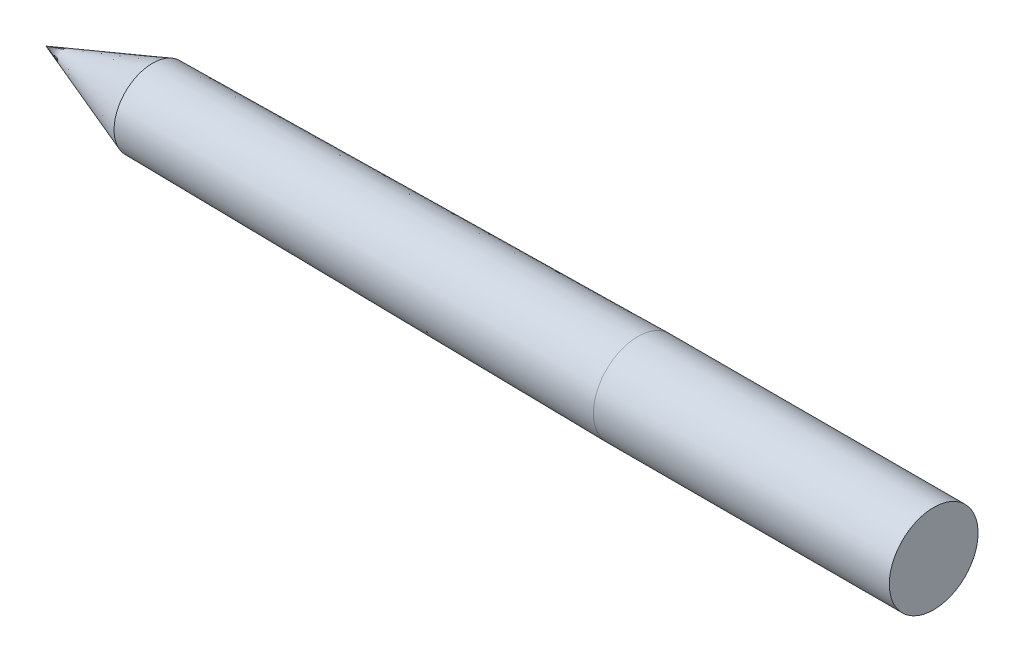
ISO-10303-21;
HEADER;
FILE_DESCRIPTION(('STEP AP214'),'2;1');
FILE_NAME('part.step','',(''),(''),'','','');
FILE_SCHEMA(('AUTOMOTIVE_DESIGN { 1 0 10303 214 1 1 1 1 }'));
ENDSEC;
DATA;
#1=APPLICATION_CONTEXT('core data for automotive mechanical design processes');
#2=APPLICATION_PROTOCOL_DEFINITION('international standard','automotive_design',2000,#1);
#3=PRODUCT_CONTEXT('',#1,'mechanical');
#4=PRODUCT('Part','Part','',(#3));
#5=PRODUCT_RELATED_PRODUCT_CATEGORY('part','',(#4));
#6=PRODUCT_DEFINITION_FORMATION('','',#4);
#7=PRODUCT_DEFINITION_CONTEXT('part definition',#1,'design');
#8=PRODUCT_DEFINITION('design','',#6,#7);
#9=PRODUCT_DEFINITION_SHAPE('','',#8);
#10=(LENGTH_UNIT() NAMED_UNIT(*) SI_UNIT(.MILLI.,.METRE.));
#11=(NAMED_UNIT(*) PLANE_ANGLE_UNIT() SI_UNIT($,.RADIAN.));
#12=(NAMED_UNIT(*) SI_UNIT($,.STERADIAN.) SOLID_ANGLE_UNIT());
#13=UNCERTAINTY_MEASURE_WITH_UNIT(LENGTH_MEASURE(1.E-05),#10,'distance_accuracy_value','');
#14=(GEOMETRIC_REPRESENTATION_CONTEXT(3) GLOBAL_UNCERTAINTY_ASSIGNED_CONTEXT((#13)) GLOBAL_UNIT_ASSIGNED_CONTEXT((#10,
#11,#12)) REPRESENTATION_CONTEXT('',''));
#15=CARTESIAN_POINT('',(0.,0.,0.));
#16=DIRECTION('',(0.,0.,1.));
#17=DIRECTION('',(1.,0.,0.));
#18=AXIS2_PLACEMENT_3D('',#15,#16,#17);
#19=CARTESIAN_POINT('',(3.6,0.,0.));
#20=DIRECTION('',(1.,0.,0.));
#21=DIRECTION('',(0.,0.,-1.));
#22=AXIS2_PLACEMENT_3D('',#19,#20,#21);
#23=CONICAL_SURFACE('',#22,1.3,0.346538864433942);
#24=CARTESIAN_POINT('',(0.,0.,0.));
#25=VERTEX_POINT('',#24);
#26=VERTEX_LOOP('',#25);
#27=FACE_BOUND('',#26,.T.);
#28=CARTESIAN_POINT('',(3.6,0.,0.));
#29=DIRECTION('',(-1.,0.,0.));
#30=DIRECTION('',(0.,0.,1.));
#31=AXIS2_PLACEMENT_3D('',#28,#29,#30);
#32=CIRCLE('',#31,1.3);
#33=CARTESIAN_POINT('',(3.6,0.,1.3));
#34=VERTEX_POINT('',#33);
#35=EDGE_CURVE('E47',#34,#34,#32,.T.);
#36=ORIENTED_EDGE('',*,*,#35,.T.);
#37=EDGE_LOOP('',(#36));
#38=FACE_BOUND('',#37,.T.);
#39=ADVANCED_FACE('F33',(#27,#38),#23,.T.);
#40=CARTESIAN_POINT('',(30.,1.5,0.));
#41=DIRECTION('',(-1.,0.,0.));
#42=DIRECTION('',(0.,0.,1.));
#43=AXIS2_PLACEMENT_3D('',#40,#41,#42);
#44=PLANE('',#43);
#45=CARTESIAN_POINT('',(30.,0.,0.));
#46=DIRECTION('',(-1.,0.,0.));
#47=DIRECTION('',(0.,0.,1.));
#48=AXIS2_PLACEMENT_3D('',#45,#46,#47);
#49=CIRCLE('',#48,1.5);
#50=CARTESIAN_POINT('',(30.,0.,1.5));
#51=VERTEX_POINT('',#50);
#52=EDGE_CURVE('E11',#51,#51,#49,.T.);
#53=ORIENTED_EDGE('',*,*,#52,.F.);
#54=EDGE_LOOP('',(#53));
#55=FACE_BOUND('',#54,.T.);
#56=ADVANCED_FACE('F44',(#55),#44,.F.);
#57=CARTESIAN_POINT('',(0.,0.,0.));
#58=DIRECTION('',(-1.,0.,0.));
#59=DIRECTION('',(0.,0.,1.));
#60=AXIS2_PLACEMENT_3D('',#57,#58,#59);
#61=CYLINDRICAL_SURFACE('',#60,1.5);
#62=CARTESIAN_POINT('',(20.,0.,0.));
#63=DIRECTION('',(-1.,0.,0.));
#64=DIRECTION('',(0.,0.,1.));
#65=AXIS2_PLACEMENT_3D('',#62,#63,#64);
#66=CIRCLE('',#65,1.5);
#67=CARTESIAN_POINT('',(20.,0.,1.5));
#68=VERTEX_POINT('',#67);
#69=EDGE_CURVE('E39',#68,#68,#66,.T.);
#70=ORIENTED_EDGE('',*,*,#69,.F.);
#71=EDGE_LOOP('',(#70));
#72=FACE_BOUND('',#71,.T.);
#73=ORIENTED_EDGE('',*,*,#52,.T.);
#74=EDGE_LOOP('',(#73));
#75=FACE_BOUND('',#74,.T.);
#76=ADVANCED_FACE('F55',(#72,#75),#61,.T.);
#77=CARTESIAN_POINT('',(20.,0.,0.));
#78=DIRECTION('',(1.,0.,0.));
#79=DIRECTION('',(0.,0.,-1.));
#80=AXIS2_PLACEMENT_3D('',#77,#78,#79);
#81=CONICAL_SURFACE('',#80,1.5,0.0121945174482517);
#82=ORIENTED_EDGE('',*,*,#35,.F.);
#83=EDGE_LOOP('',(#82));
#84=FACE_BOUND('',#83,.T.);
#85=ORIENTED_EDGE('',*,*,#69,.T.);
#86=EDGE_LOOP('',(#85));
#87=FACE_BOUND('',#86,.T.);
#88=ADVANCED_FACE('F53',(#84,#87),#81,.T.);
#89=CLOSED_SHELL('',(#39,#56,#76,#88));
#90=MANIFOLD_SOLID_BREP('B2',#89);
#91=ADVANCED_BREP_SHAPE_REPRESENTATION('',(#18,#90),#14);
#92=SHAPE_DEFINITION_REPRESENTATION(#9,#91);
ENDSEC;
END-ISO-10303-21;
